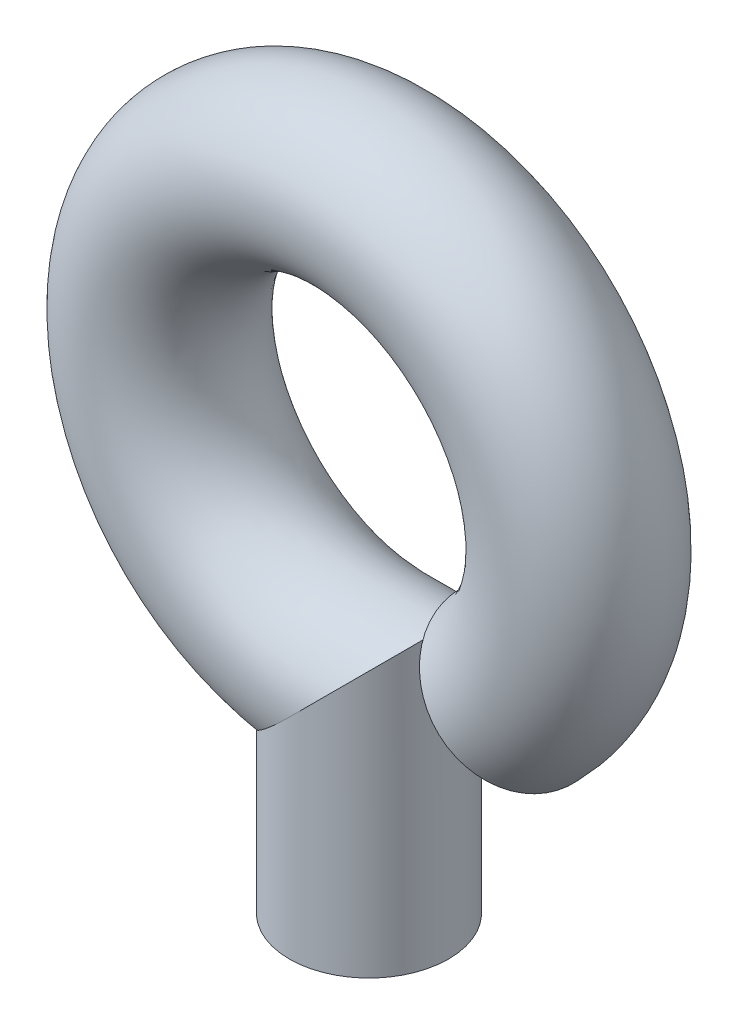
ISO-10303-21;
HEADER;
FILE_DESCRIPTION(('STEP AP214'),'2;1');
FILE_NAME('part.step','',(''),(''),'','','');
FILE_SCHEMA(('AUTOMOTIVE_DESIGN { 1 0 10303 214 1 1 1 1 }'));
ENDSEC;
DATA;
#1=APPLICATION_CONTEXT('core data for automotive mechanical design processes');
#2=APPLICATION_PROTOCOL_DEFINITION('international standard','automotive_design',2000,#1);
#3=PRODUCT_CONTEXT('',#1,'mechanical');
#4=PRODUCT('Part','Part','',(#3));
#5=PRODUCT_RELATED_PRODUCT_CATEGORY('part','',(#4));
#6=PRODUCT_DEFINITION_FORMATION('','',#4);
#7=PRODUCT_DEFINITION_CONTEXT('part definition',#1,'design');
#8=PRODUCT_DEFINITION('design','',#6,#7);
#9=PRODUCT_DEFINITION_SHAPE('','',#8);
#10=(LENGTH_UNIT() NAMED_UNIT(*) SI_UNIT(.MILLI.,.METRE.));
#11=(NAMED_UNIT(*) PLANE_ANGLE_UNIT() SI_UNIT($,.RADIAN.));
#12=(NAMED_UNIT(*) SI_UNIT($,.STERADIAN.) SOLID_ANGLE_UNIT());
#13=UNCERTAINTY_MEASURE_WITH_UNIT(LENGTH_MEASURE(1.E-05),#10,'distance_accuracy_value','');
#14=(GEOMETRIC_REPRESENTATION_CONTEXT(3) GLOBAL_UNCERTAINTY_ASSIGNED_CONTEXT((#13)) GLOBAL_UNIT_ASSIGNED_CONTEXT((#10,
#11,#12)) REPRESENTATION_CONTEXT('',''));
#15=CARTESIAN_POINT('',(0.,0.,0.));
#16=DIRECTION('',(0.,0.,1.));
#17=DIRECTION('',(1.,0.,0.));
#18=AXIS2_PLACEMENT_3D('',#15,#16,#17);
#19=CARTESIAN_POINT('',(8.96291702604749,16.4024381978122,0.));
#20=DIRECTION('',(0.70846943324313,0.705741498113976,0.));
#21=DIRECTION('',(-0.705741498113976,0.70846943324313,0.));
#22=AXIS2_PLACEMENT_3D('',#19,#20,#21);
#23=PLANE('',#22);
#24=CARTESIAN_POINT('',(8.96291702604749,16.4024381978122,0.));
#25=DIRECTION('',(0.70846943324313,0.705741498113976,0.));
#26=DIRECTION('',(-0.705741498113976,0.70846943324313,0.));
#27=AXIS2_PLACEMENT_3D('',#24,#25,#26);
#28=CIRCLE('',#27,4.826);
#29=CARTESIAN_POINT('',(5.55700855614944,19.8215116826436,0.));
#30=VERTEX_POINT('',#29);
#31=EDGE_CURVE('E54',#30,#30,#28,.T.);
#32=ORIENTED_EDGE('',*,*,#31,.F.);
#33=EDGE_LOOP('',(#32));
#34=FACE_BOUND('',#33,.T.);
#35=ADVANCED_FACE('F51',(#34),#23,.F.);
#36=CARTESIAN_POINT('',(0.,0.,0.));
#37=DIRECTION('',(0.,-1.,0.));
#38=DIRECTION('',(1.,0.,0.));
#39=AXIS2_PLACEMENT_3D('',#36,#37,#38);
#40=PLANE('',#39);
#41=CARTESIAN_POINT('',(0.,0.,0.));
#42=DIRECTION('',(0.,-1.,0.));
#43=DIRECTION('',(1.,0.,0.));
#44=AXIS2_PLACEMENT_3D('',#41,#42,#43);
#45=CIRCLE('',#44,4.826);
#46=CARTESIAN_POINT('',(4.826,0.,0.));
#47=VERTEX_POINT('',#46);
#48=EDGE_CURVE('E71',#47,#47,#45,.T.);
#49=ORIENTED_EDGE('',*,*,#48,.T.);
#50=EDGE_LOOP('',(#49));
#51=FACE_BOUND('',#50,.T.);
#52=ADVANCED_FACE('F75',(#51),#40,.T.);
#53=CARTESIAN_POINT('',(5.4086,17.526,0.));
#54=CARTESIAN_POINT('',(4.50716666666808,17.526,0.));
#55=CARTESIAN_POINT('',(3.6057333333327,17.526,0.));
#56=CARTESIAN_POINT('',(2.25358333333365,17.526,0.));
#57=CARTESIAN_POINT('',(1.80286666666713,17.526,0.));
#58=CARTESIAN_POINT('',(1.12679166666643,17.526,0.));
#59=CARTESIAN_POINT('',(0.901433333333169,17.526,0.));
#60=CARTESIAN_POINT('',(0.563395833333408,17.526,0.));
#61=CARTESIAN_POINT('',(0.450716666666778,17.526,0.));
#62=CARTESIAN_POINT('',(0.225358333333213,17.526,0.));
#63=CARTESIAN_POINT('',(0.0912700971983508,17.5259986247839,0.));
#64=CARTESIAN_POINT('',(-0.0737885705267274,17.5260011118124,0.));
#65=CARTESIAN_POINT('',(-0.112948067890733,17.5266077038465,0.));
#66=CARTESIAN_POINT('',(-0.225838103046428,17.5290368653846,0.));
#67=CARTESIAN_POINT('',(-0.282260227223491,17.5308583253357,0.));
#68=CARTESIAN_POINT('',(-0.451425103478683,17.538140582317,0.));
#69=CARTESIAN_POINT('',(-0.564066616799512,17.5454194189327,0.));
#70=CARTESIAN_POINT('',(-0.901313613403931,17.5745009883571,0.));
#71=CARTESIAN_POINT('',(-1.1252445002673,17.6035526562468,0.));
#72=CARTESIAN_POINT('',(-1.79202754588701,17.7193701591522,0.));
#73=CARTESIAN_POINT('',(-2.22986929565793,17.8348792992875,0.));
#74=CARTESIAN_POINT('',(-3.50394790292318,18.2911186349695,0.));
#75=CARTESIAN_POINT('',(-4.29942197102122,18.7420138670557,0.));
#76=CARTESIAN_POINT('',(-5.69393839375073,19.8870267369146,0.));
#77=CARTESIAN_POINT('',(-6.29147007152276,20.5800450731297,0.));
#78=CARTESIAN_POINT('',(-7.21896736269934,22.1287507929993,0.));
#79=CARTESIAN_POINT('',(-7.54786288814307,22.9826513340009,0.));
#80=CARTESIAN_POINT('',(-7.89902347578029,24.7525149576165,0.));
#81=CARTESIAN_POINT('',(-7.92105494716986,25.6673007329981,0.));
#82=CARTESIAN_POINT('',(-7.6551010173477,27.4528004219139,0.));
#83=CARTESIAN_POINT('',(-7.36742247174094,28.321454239595,0.));
#84=CARTESIAN_POINT('',(-6.51570011121342,29.9121459209371,0.));
#85=CARTESIAN_POINT('',(-5.95222285910246,30.6331256619263,0.));
#86=CARTESIAN_POINT('',(-4.61363660664622,31.8442934771664,0.));
#87=CARTESIAN_POINT('',(-3.84007205686405,32.3330841152564,0.));
#88=CARTESIAN_POINT('',(-2.17239149631208,33.0219763800396,0.));
#89=CARTESIAN_POINT('',(-1.27938482096156,33.221619757942,0.));
#90=CARTESIAN_POINT('',(0.523734011059012,33.3082402494927,0.));
#91=CARTESIAN_POINT('',(1.43176574301625,33.1951174210693,0.));
#92=CARTESIAN_POINT('',(3.15780213130015,32.6692568018131,0.));
#93=CARTESIAN_POINT('',(3.97465863408128,32.2568688116745,0.));
#94=CARTESIAN_POINT('',(5.42318008936349,31.1795915838683,0.));
#95=CARTESIAN_POINT('',(6.05317374887859,30.5159453004384,0.));
#96=CARTESIAN_POINT('',(7.05345341156542,29.0142224228709,0.));
#97=CARTESIAN_POINT('',(7.42307403210196,28.1771447697136,0.));
#98=CARTESIAN_POINT('',(7.85895644677222,26.4253607783114,0.));
#99=CARTESIAN_POINT('',(7.92471531649008,25.5126755689982,0.));
#100=CARTESIAN_POINT('',(7.65488157421396,22.8196134765485,0.));
#101=CARTESIAN_POINT('',(6.83747144611513,21.0970441983539,0.));
#102=CARTESIAN_POINT('',(5.55700855614944,19.8215116826436,0.));
#103=CARTESIAN_POINT('',(5.4086,17.526,9.652));
#104=CARTESIAN_POINT('',(4.50716666666808,17.526,9.652));
#105=CARTESIAN_POINT('',(3.6057333333327,17.526,9.652));
#106=CARTESIAN_POINT('',(2.25358333333365,17.526,9.652));
#107=CARTESIAN_POINT('',(1.80286666666713,17.526,9.652));
#108=CARTESIAN_POINT('',(1.12679166666643,17.526,9.652));
#109=CARTESIAN_POINT('',(0.901433333333169,17.526,9.652));
#110=CARTESIAN_POINT('',(0.563395833333408,17.526,9.652));
#111=CARTESIAN_POINT('',(0.450716666666778,17.526,9.652));
#112=CARTESIAN_POINT('',(0.225358333333213,17.526,9.652));
#113=CARTESIAN_POINT('',(0.0912700971983508,17.5259986247839,9.652));
#114=CARTESIAN_POINT('',(-0.0737885705267274,17.5260011118124,9.652));
#115=CARTESIAN_POINT('',(-0.112948067890733,17.5266077038465,9.652));
#116=CARTESIAN_POINT('',(-0.225838103046428,17.5290368653846,9.652));
#117=CARTESIAN_POINT('',(-0.282260227223491,17.5308583253357,9.652));
#118=CARTESIAN_POINT('',(-0.451425103478683,17.538140582317,9.652));
#119=CARTESIAN_POINT('',(-0.564066616799512,17.5454194189327,9.652));
#120=CARTESIAN_POINT('',(-0.901313613403931,17.5745009883571,9.652));
#121=CARTESIAN_POINT('',(-1.1252445002673,17.6035526562468,9.652));
#122=CARTESIAN_POINT('',(-1.79202754588701,17.7193701591522,9.652));
#123=CARTESIAN_POINT('',(-2.22986929565793,17.8348792992875,9.652));
#124=CARTESIAN_POINT('',(-3.50394790292318,18.2911186349695,9.652));
#125=CARTESIAN_POINT('',(-4.29942197102122,18.7420138670557,9.652));
#126=CARTESIAN_POINT('',(-5.69393839375073,19.8870267369146,9.652));
#127=CARTESIAN_POINT('',(-6.29147007152276,20.5800450731297,9.652));
#128=CARTESIAN_POINT('',(-7.21896736269934,22.1287507929993,9.652));
#129=CARTESIAN_POINT('',(-7.54786288814307,22.9826513340009,9.652));
#130=CARTESIAN_POINT('',(-7.89902347578029,24.7525149576165,9.652));
#131=CARTESIAN_POINT('',(-7.92105494716986,25.6673007329981,9.652));
#132=CARTESIAN_POINT('',(-7.6551010173477,27.4528004219139,9.652));
#133=CARTESIAN_POINT('',(-7.36742247174094,28.321454239595,9.652));
#134=CARTESIAN_POINT('',(-6.51570011121342,29.9121459209371,9.652));
#135=CARTESIAN_POINT('',(-5.95222285910246,30.6331256619263,9.652));
#136=CARTESIAN_POINT('',(-4.61363660664622,31.8442934771664,9.652));
#137=CARTESIAN_POINT('',(-3.84007205686405,32.3330841152564,9.652));
#138=CARTESIAN_POINT('',(-2.17239149631208,33.0219763800396,9.652));
#139=CARTESIAN_POINT('',(-1.27938482096156,33.221619757942,9.652));
#140=CARTESIAN_POINT('',(0.523734011059012,33.3082402494927,9.652));
#141=CARTESIAN_POINT('',(1.43176574301625,33.1951174210693,9.652));
#142=CARTESIAN_POINT('',(3.15780213130015,32.6692568018131,9.652));
#143=CARTESIAN_POINT('',(3.97465863408128,32.2568688116745,9.652));
#144=CARTESIAN_POINT('',(5.42318008936349,31.1795915838683,9.652));
#145=CARTESIAN_POINT('',(6.05317374887859,30.5159453004384,9.652));
#146=CARTESIAN_POINT('',(7.05345341156542,29.0142224228709,9.652));
#147=CARTESIAN_POINT('',(7.42307403210196,28.1771447697136,9.652));
#148=CARTESIAN_POINT('',(7.85895644677222,26.4253607783114,9.652));
#149=CARTESIAN_POINT('',(7.92471531649008,25.5126755689982,9.652));
#150=CARTESIAN_POINT('',(7.65488157421396,22.8196134765485,9.652));
#151=CARTESIAN_POINT('',(6.83747144611513,21.0970441983539,9.652));
#152=CARTESIAN_POINT('',(5.55700855614944,19.8215116826436,9.652));
#153=CARTESIAN_POINT('',(5.40860000000001,7.874,9.652));
#154=CARTESIAN_POINT('',(4.5071666666681,7.874,9.652));
#155=CARTESIAN_POINT('',(3.60573333333271,7.874,9.652));
#156=CARTESIAN_POINT('',(2.25358333333366,7.874,9.652));
#157=CARTESIAN_POINT('',(1.80286666666714,7.874,9.652));
#158=CARTESIAN_POINT('',(1.12679166666644,7.874,9.652));
#159=CARTESIAN_POINT('',(0.901433333333179,7.874,9.652));
#160=CARTESIAN_POINT('',(0.563395833333418,7.874,9.652));
#161=CARTESIAN_POINT('',(0.450716666666789,7.874,9.652));
#162=CARTESIAN_POINT('',(0.225358333333223,7.874,9.652));
#163=CARTESIAN_POINT('',(0.134088146452126,7.87399693903532,9.652));
#164=CARTESIAN_POINT('',(-0.108405413766313,7.87400247467917,9.652));
#165=CARTESIAN_POINT('',(-0.251400538208715,7.87535263114206,9.652));
#166=CARTESIAN_POINT('',(-0.502671906780436,7.8807594745659,9.652));
#167=CARTESIAN_POINT('',(-0.62825663478818,7.88481369187582,9.652));
#168=CARTESIAN_POINT('',(-1.00478490774202,7.90102258644828,9.652));
#169=CARTESIAN_POINT('',(-1.25550311481118,7.91722386794645,9.652));
#170=CARTESIAN_POINT('',(-2.00614965564224,7.98195381279585,9.652));
#171=CARTESIAN_POINT('',(-2.50457646833795,8.04661720261307,9.652));
#172=CARTESIAN_POINT('',(-3.98870647310123,8.30440454779178,9.652));
#173=CARTESIAN_POINT('',(-4.96325746452233,8.56150553712354,9.652));
#174=CARTESIAN_POINT('',(-7.79910984845509,9.57700599396508,9.652));
#175=CARTESIAN_POINT('',(-9.56968116131326,10.5806115105413,9.652));
#176=CARTESIAN_POINT('',(-12.6736048118888,13.129188543457,9.652));
#177=CARTESIAN_POINT('',(-14.0035946753295,14.6717132272886,9.652));
#178=CARTESIAN_POINT('',(-16.0680241298745,18.1188324102244,9.652));
#179=CARTESIAN_POINT('',(-16.8000819123097,20.0194497434221,9.652));
#180=CARTESIAN_POINT('',(-17.5816974138423,23.958823615339,9.652));
#181=CARTESIAN_POINT('',(-17.6307352049946,25.9949596960239,9.652));
#182=CARTESIAN_POINT('',(-17.0387732321574,29.9691364229738,9.652));
#183=CARTESIAN_POINT('',(-16.3984564693557,31.9025916945763,9.652));
#184=CARTESIAN_POINT('',(-14.502687344317,35.4431635014467,9.652));
#185=CARTESIAN_POINT('',(-13.2484960412291,37.0479248604231,9.652));
#186=CARTESIAN_POINT('',(-10.2690621244696,39.7437499975575,9.652));
#187=CARTESIAN_POINT('',(-8.54725715882737,40.8317033533085,9.652));
#188=CARTESIAN_POINT('',(-4.8353230079195,42.3650442007376,9.652));
#189=CARTESIAN_POINT('',(-2.84766298858795,42.8094117192991,9.652));
#190=CARTESIAN_POINT('',(1.16573054074034,43.0022121682168,9.652));
#191=CARTESIAN_POINT('',(3.18683342799616,42.7504226468972,9.652));
#192=CARTESIAN_POINT('',(7.02865635677258,41.5799586879055,9.652));
#193=CARTESIAN_POINT('',(8.84682083069643,40.6620628388859,9.652));
#194=CARTESIAN_POINT('',(12.0709492311645,38.2642522350643,9.652));
#195=CARTESIAN_POINT('',(13.4731931829853,36.7871040558085,9.652));
#196=CARTESIAN_POINT('',(15.6996221096159,33.444559586396,9.652));
#197=CARTESIAN_POINT('',(16.5223260714514,31.5813867454929,9.652));
#198=CARTESIAN_POINT('',(17.4925159621718,27.682254635595,9.652));
#199=CARTESIAN_POINT('',(17.6388824786401,25.6507940084115,9.652));
#200=CARTESIAN_POINT('',(17.0382847942163,19.6565590284545,9.652));
#201=CARTESIAN_POINT('',(15.2188880574924,15.8224532156537,9.652));
#202=CARTESIAN_POINT('',(12.3688254959455,12.9833647129809,9.652));
#203=CARTESIAN_POINT('',(5.40860000000001,7.874,0.));
#204=CARTESIAN_POINT('',(4.5071666666681,7.874,0.));
#205=CARTESIAN_POINT('',(3.60573333333271,7.874,0.));
#206=CARTESIAN_POINT('',(2.25358333333366,7.874,0.));
#207=CARTESIAN_POINT('',(1.80286666666714,7.874,0.));
#208=CARTESIAN_POINT('',(1.12679166666644,7.874,0.));
#209=CARTESIAN_POINT('',(0.901433333333179,7.874,0.));
#210=CARTESIAN_POINT('',(0.563395833333418,7.874,0.));
#211=CARTESIAN_POINT('',(0.450716666666789,7.874,0.));
#212=CARTESIAN_POINT('',(0.225358333333223,7.874,0.));
#213=CARTESIAN_POINT('',(0.134088146452126,7.87399693903532,0.));
#214=CARTESIAN_POINT('',(-0.108405413766313,7.87400247467917,0.));
#215=CARTESIAN_POINT('',(-0.251400538208715,7.87535263114206,0.));
#216=CARTESIAN_POINT('',(-0.502671906780436,7.8807594745659,0.));
#217=CARTESIAN_POINT('',(-0.62825663478818,7.88481369187582,0.));
#218=CARTESIAN_POINT('',(-1.00478490774202,7.90102258644828,0.));
#219=CARTESIAN_POINT('',(-1.25550311481118,7.91722386794645,0.));
#220=CARTESIAN_POINT('',(-2.00614965564224,7.98195381279585,0.));
#221=CARTESIAN_POINT('',(-2.50457646833795,8.04661720261307,0.));
#222=CARTESIAN_POINT('',(-3.98870647310123,8.30440454779178,0.));
#223=CARTESIAN_POINT('',(-4.96325746452233,8.56150553712354,0.));
#224=CARTESIAN_POINT('',(-7.79910984845509,9.57700599396508,0.));
#225=CARTESIAN_POINT('',(-9.56968116131326,10.5806115105413,0.));
#226=CARTESIAN_POINT('',(-12.6736048118888,13.129188543457,0.));
#227=CARTESIAN_POINT('',(-14.0035946753295,14.6717132272886,0.));
#228=CARTESIAN_POINT('',(-16.0680241298745,18.1188324102244,0.));
#229=CARTESIAN_POINT('',(-16.8000819123097,20.0194497434221,0.));
#230=CARTESIAN_POINT('',(-17.5816974138423,23.958823615339,0.));
#231=CARTESIAN_POINT('',(-17.6307352049946,25.9949596960239,0.));
#232=CARTESIAN_POINT('',(-17.0387732321574,29.9691364229738,0.));
#233=CARTESIAN_POINT('',(-16.3984564693557,31.9025916945763,0.));
#234=CARTESIAN_POINT('',(-14.502687344317,35.4431635014467,0.));
#235=CARTESIAN_POINT('',(-13.2484960412291,37.0479248604231,0.));
#236=CARTESIAN_POINT('',(-10.2690621244696,39.7437499975575,0.));
#237=CARTESIAN_POINT('',(-8.54725715882737,40.8317033533085,0.));
#238=CARTESIAN_POINT('',(-4.8353230079195,42.3650442007376,0.));
#239=CARTESIAN_POINT('',(-2.84766298858795,42.8094117192991,0.));
#240=CARTESIAN_POINT('',(1.16573054074034,43.0022121682168,0.));
#241=CARTESIAN_POINT('',(3.18683342799616,42.7504226468972,0.));
#242=CARTESIAN_POINT('',(7.02865635677258,41.5799586879055,0.));
#243=CARTESIAN_POINT('',(8.84682083069643,40.6620628388859,0.));
#244=CARTESIAN_POINT('',(12.0709492311645,38.2642522350643,0.));
#245=CARTESIAN_POINT('',(13.4731931829853,36.7871040558085,0.));
#246=CARTESIAN_POINT('',(15.6996221096159,33.444559586396,0.));
#247=CARTESIAN_POINT('',(16.5223260714514,31.5813867454929,0.));
#248=CARTESIAN_POINT('',(17.4925159621718,27.682254635595,0.));
#249=CARTESIAN_POINT('',(17.6388824786401,25.6507940084115,0.));
#250=CARTESIAN_POINT('',(17.0382847942163,19.6565590284545,0.));
#251=CARTESIAN_POINT('',(15.2188880574924,15.8224532156537,0.));
#252=CARTESIAN_POINT('',(12.3688254959455,12.9833647129809,0.));
#253=CARTESIAN_POINT('',(5.40860000000001,7.874,-9.652));
#254=CARTESIAN_POINT('',(4.5071666666681,7.874,-9.652));
#255=CARTESIAN_POINT('',(3.60573333333271,7.874,-9.652));
#256=CARTESIAN_POINT('',(2.25358333333366,7.874,-9.652));
#257=CARTESIAN_POINT('',(1.80286666666714,7.874,-9.652));
#258=CARTESIAN_POINT('',(1.12679166666644,7.874,-9.652));
#259=CARTESIAN_POINT('',(0.901433333333179,7.874,-9.652));
#260=CARTESIAN_POINT('',(0.563395833333418,7.874,-9.652));
#261=CARTESIAN_POINT('',(0.450716666666789,7.874,-9.652));
#262=CARTESIAN_POINT('',(0.225358333333223,7.874,-9.652));
#263=CARTESIAN_POINT('',(0.134088146452126,7.87399693903532,-9.652));
#264=CARTESIAN_POINT('',(-0.108405413766313,7.87400247467917,-9.652));
#265=CARTESIAN_POINT('',(-0.251400538208715,7.87535263114206,-9.652));
#266=CARTESIAN_POINT('',(-0.502671906780436,7.8807594745659,-9.652));
#267=CARTESIAN_POINT('',(-0.62825663478818,7.88481369187582,-9.652));
#268=CARTESIAN_POINT('',(-1.00478490774202,7.90102258644828,-9.652));
#269=CARTESIAN_POINT('',(-1.25550311481118,7.91722386794645,-9.652));
#270=CARTESIAN_POINT('',(-2.00614965564224,7.98195381279585,-9.652));
#271=CARTESIAN_POINT('',(-2.50457646833795,8.04661720261307,-9.652));
#272=CARTESIAN_POINT('',(-3.98870647310123,8.30440454779178,-9.652));
#273=CARTESIAN_POINT('',(-4.96325746452233,8.56150553712354,-9.652));
#274=CARTESIAN_POINT('',(-7.79910984845509,9.57700599396508,-9.652));
#275=CARTESIAN_POINT('',(-9.56968116131326,10.5806115105413,-9.652));
#276=CARTESIAN_POINT('',(-12.6736048118888,13.129188543457,-9.652));
#277=CARTESIAN_POINT('',(-14.0035946753295,14.6717132272886,-9.652));
#278=CARTESIAN_POINT('',(-16.0680241298745,18.1188324102244,-9.652));
#279=CARTESIAN_POINT('',(-16.8000819123097,20.0194497434221,-9.652));
#280=CARTESIAN_POINT('',(-17.5816974138423,23.958823615339,-9.652));
#281=CARTESIAN_POINT('',(-17.6307352049946,25.9949596960239,-9.652));
#282=CARTESIAN_POINT('',(-17.0387732321574,29.9691364229738,-9.652));
#283=CARTESIAN_POINT('',(-16.3984564693557,31.9025916945763,-9.652));
#284=CARTESIAN_POINT('',(-14.502687344317,35.4431635014467,-9.652));
#285=CARTESIAN_POINT('',(-13.2484960412291,37.0479248604231,-9.652));
#286=CARTESIAN_POINT('',(-10.2690621244696,39.7437499975575,-9.652));
#287=CARTESIAN_POINT('',(-8.54725715882737,40.8317033533085,-9.652));
#288=CARTESIAN_POINT('',(-4.8353230079195,42.3650442007376,-9.652));
#289=CARTESIAN_POINT('',(-2.84766298858795,42.8094117192991,-9.652));
#290=CARTESIAN_POINT('',(1.16573054074034,43.0022121682168,-9.652));
#291=CARTESIAN_POINT('',(3.18683342799616,42.7504226468972,-9.652));
#292=CARTESIAN_POINT('',(7.02865635677258,41.5799586879055,-9.652));
#293=CARTESIAN_POINT('',(8.84682083069643,40.6620628388859,-9.652));
#294=CARTESIAN_POINT('',(12.0709492311645,38.2642522350643,-9.652));
#295=CARTESIAN_POINT('',(13.4731931829853,36.7871040558085,-9.652));
#296=CARTESIAN_POINT('',(15.6996221096159,33.444559586396,-9.652));
#297=CARTESIAN_POINT('',(16.5223260714514,31.5813867454929,-9.652));
#298=CARTESIAN_POINT('',(17.4925159621718,27.682254635595,-9.652));
#299=CARTESIAN_POINT('',(17.6388824786401,25.6507940084115,-9.652));
#300=CARTESIAN_POINT('',(17.0382847942163,19.6565590284545,-9.652));
#301=CARTESIAN_POINT('',(15.2188880574924,15.8224532156537,-9.652));
#302=CARTESIAN_POINT('',(12.3688254959455,12.9833647129809,-9.652));
#303=CARTESIAN_POINT('',(5.4086,17.526,-9.652));
#304=CARTESIAN_POINT('',(4.50716666666808,17.526,-9.652));
#305=CARTESIAN_POINT('',(3.6057333333327,17.526,-9.652));
#306=CARTESIAN_POINT('',(2.25358333333365,17.526,-9.652));
#307=CARTESIAN_POINT('',(1.80286666666713,17.526,-9.652));
#308=CARTESIAN_POINT('',(1.12679166666643,17.526,-9.652));
#309=CARTESIAN_POINT('',(0.901433333333169,17.526,-9.652));
#310=CARTESIAN_POINT('',(0.563395833333408,17.526,-9.652));
#311=CARTESIAN_POINT('',(0.450716666666778,17.526,-9.652));
#312=CARTESIAN_POINT('',(0.225358333333213,17.526,-9.652));
#313=CARTESIAN_POINT('',(0.0912700971983508,17.5259986247839,-9.652));
#314=CARTESIAN_POINT('',(-0.0737885705267274,17.5260011118124,-9.652));
#315=CARTESIAN_POINT('',(-0.112948067890733,17.5266077038465,-9.652));
#316=CARTESIAN_POINT('',(-0.225838103046428,17.5290368653846,-9.652));
#317=CARTESIAN_POINT('',(-0.282260227223491,17.5308583253357,-9.652));
#318=CARTESIAN_POINT('',(-0.451425103478683,17.538140582317,-9.652));
#319=CARTESIAN_POINT('',(-0.564066616799512,17.5454194189327,-9.652));
#320=CARTESIAN_POINT('',(-0.901313613403931,17.5745009883571,-9.652));
#321=CARTESIAN_POINT('',(-1.1252445002673,17.6035526562468,-9.652));
#322=CARTESIAN_POINT('',(-1.79202754588701,17.7193701591522,-9.652));
#323=CARTESIAN_POINT('',(-2.22986929565793,17.8348792992875,-9.652));
#324=CARTESIAN_POINT('',(-3.50394790292318,18.2911186349695,-9.652));
#325=CARTESIAN_POINT('',(-4.29942197102122,18.7420138670557,-9.652));
#326=CARTESIAN_POINT('',(-5.69393839375073,19.8870267369146,-9.652));
#327=CARTESIAN_POINT('',(-6.29147007152276,20.5800450731297,-9.652));
#328=CARTESIAN_POINT('',(-7.21896736269934,22.1287507929993,-9.652));
#329=CARTESIAN_POINT('',(-7.54786288814307,22.9826513340009,-9.652));
#330=CARTESIAN_POINT('',(-7.89902347578029,24.7525149576165,-9.652));
#331=CARTESIAN_POINT('',(-7.92105494716986,25.6673007329981,-9.652));
#332=CARTESIAN_POINT('',(-7.6551010173477,27.4528004219139,-9.652));
#333=CARTESIAN_POINT('',(-7.36742247174094,28.321454239595,-9.652));
#334=CARTESIAN_POINT('',(-6.51570011121342,29.9121459209371,-9.652));
#335=CARTESIAN_POINT('',(-5.95222285910246,30.6331256619263,-9.652));
#336=CARTESIAN_POINT('',(-4.61363660664622,31.8442934771664,-9.652));
#337=CARTESIAN_POINT('',(-3.84007205686405,32.3330841152564,-9.652));
#338=CARTESIAN_POINT('',(-2.17239149631208,33.0219763800396,-9.652));
#339=CARTESIAN_POINT('',(-1.27938482096156,33.221619757942,-9.652));
#340=CARTESIAN_POINT('',(0.523734011059012,33.3082402494927,-9.652));
#341=CARTESIAN_POINT('',(1.43176574301625,33.1951174210693,-9.652));
#342=CARTESIAN_POINT('',(3.15780213130015,32.6692568018131,-9.652));
#343=CARTESIAN_POINT('',(3.97465863408128,32.2568688116745,-9.652));
#344=CARTESIAN_POINT('',(5.42318008936349,31.1795915838683,-9.652));
#345=CARTESIAN_POINT('',(6.05317374887859,30.5159453004384,-9.652));
#346=CARTESIAN_POINT('',(7.05345341156542,29.0142224228709,-9.652));
#347=CARTESIAN_POINT('',(7.42307403210196,28.1771447697136,-9.652));
#348=CARTESIAN_POINT('',(7.85895644677222,26.4253607783114,-9.652));
#349=CARTESIAN_POINT('',(7.92471531649008,25.5126755689982,-9.652));
#350=CARTESIAN_POINT('',(7.65488157421396,22.8196134765485,-9.652));
#351=CARTESIAN_POINT('',(6.83747144611513,21.0970441983539,-9.652));
#352=CARTESIAN_POINT('',(5.55700855614944,19.8215116826436,-9.652));
#353=CARTESIAN_POINT('',(5.4086,17.526,0.));
#354=CARTESIAN_POINT('',(4.50716666666808,17.526,0.));
#355=CARTESIAN_POINT('',(3.6057333333327,17.526,0.));
#356=CARTESIAN_POINT('',(2.25358333333365,17.526,0.));
#357=CARTESIAN_POINT('',(1.80286666666713,17.526,0.));
#358=CARTESIAN_POINT('',(1.12679166666643,17.526,0.));
#359=CARTESIAN_POINT('',(0.901433333333169,17.526,0.));
#360=CARTESIAN_POINT('',(0.563395833333408,17.526,0.));
#361=CARTESIAN_POINT('',(0.450716666666778,17.526,0.));
#362=CARTESIAN_POINT('',(0.225358333333213,17.526,0.));
#363=CARTESIAN_POINT('',(0.0912700971983508,17.5259986247839,0.));
#364=CARTESIAN_POINT('',(-0.0737885705267274,17.5260011118124,0.));
#365=CARTESIAN_POINT('',(-0.112948067890733,17.5266077038465,0.));
#366=CARTESIAN_POINT('',(-0.225838103046428,17.5290368653846,0.));
#367=CARTESIAN_POINT('',(-0.282260227223491,17.5308583253357,0.));
#368=CARTESIAN_POINT('',(-0.451425103478683,17.538140582317,0.));
#369=CARTESIAN_POINT('',(-0.564066616799512,17.5454194189327,0.));
#370=CARTESIAN_POINT('',(-0.901313613403931,17.5745009883571,0.));
#371=CARTESIAN_POINT('',(-1.1252445002673,17.6035526562468,0.));
#372=CARTESIAN_POINT('',(-1.79202754588701,17.7193701591522,0.));
#373=CARTESIAN_POINT('',(-2.22986929565793,17.8348792992875,0.));
#374=CARTESIAN_POINT('',(-3.50394790292318,18.2911186349695,0.));
#375=CARTESIAN_POINT('',(-4.29942197102122,18.7420138670557,0.));
#376=CARTESIAN_POINT('',(-5.69393839375073,19.8870267369146,0.));
#377=CARTESIAN_POINT('',(-6.29147007152276,20.5800450731297,0.));
#378=CARTESIAN_POINT('',(-7.21896736269934,22.1287507929993,0.));
#379=CARTESIAN_POINT('',(-7.54786288814307,22.9826513340009,0.));
#380=CARTESIAN_POINT('',(-7.89902347578029,24.7525149576165,0.));
#381=CARTESIAN_POINT('',(-7.92105494716986,25.6673007329981,0.));
#382=CARTESIAN_POINT('',(-7.6551010173477,27.4528004219139,0.));
#383=CARTESIAN_POINT('',(-7.36742247174094,28.321454239595,0.));
#384=CARTESIAN_POINT('',(-6.51570011121342,29.9121459209371,0.));
#385=CARTESIAN_POINT('',(-5.95222285910246,30.6331256619263,0.));
#386=CARTESIAN_POINT('',(-4.61363660664622,31.8442934771664,0.));
#387=CARTESIAN_POINT('',(-3.84007205686405,32.3330841152564,0.));
#388=CARTESIAN_POINT('',(-2.17239149631208,33.0219763800396,0.));
#389=CARTESIAN_POINT('',(-1.27938482096156,33.221619757942,0.));
#390=CARTESIAN_POINT('',(0.523734011059012,33.3082402494927,0.));
#391=CARTESIAN_POINT('',(1.43176574301625,33.1951174210693,0.));
#392=CARTESIAN_POINT('',(3.15780213130015,32.6692568018131,0.));
#393=CARTESIAN_POINT('',(3.97465863408128,32.2568688116745,0.));
#394=CARTESIAN_POINT('',(5.42318008936349,31.1795915838683,0.));
#395=CARTESIAN_POINT('',(6.05317374887859,30.5159453004384,0.));
#396=CARTESIAN_POINT('',(7.05345341156542,29.0142224228709,0.));
#397=CARTESIAN_POINT('',(7.42307403210196,28.1771447697136,0.));
#398=CARTESIAN_POINT('',(7.85895644677222,26.4253607783114,0.));
#399=CARTESIAN_POINT('',(7.92471531649008,25.5126755689982,0.));
#400=CARTESIAN_POINT('',(7.65488157421396,22.8196134765485,0.));
#401=CARTESIAN_POINT('',(6.83747144611513,21.0970441983539,0.));
#402=CARTESIAN_POINT('',(5.55700855614944,19.8215116826436,0.));
#403=(BOUNDED_SURFACE() B_SPLINE_SURFACE(3,3,((#53,#54,#55,#56,#57,#58,#59,#60,#61,#62,#63,#64,
#65,#66,#67,#68,#69,#70,#71,#72,#73,#74,#75,#76,#77,#78,#79,#80,#81,#82,#83,#84,#85,#86,#87,#88,
#89,#90,#91,#92,#93,#94,#95,#96,#97,#98,#99,#100,#101,#102),(#103,#104,#105,#106,#107,#108,#109,
#110,#111,#112,#113,#114,#115,#116,#117,#118,#119,#120,#121,#122,#123,#124,#125,#126,#127,#128,
#129,#130,#131,#132,#133,#134,#135,#136,#137,#138,#139,#140,#141,#142,#143,#144,#145,#146,#147,
#148,#149,#150,#151,#152),(#153,#154,#155,#156,#157,#158,#159,#160,#161,#162,#163,#164,#165,
#166,#167,#168,#169,#170,#171,#172,#173,#174,#175,#176,#177,#178,#179,#180,#181,#182,#183,#184,
#185,#186,#187,#188,#189,#190,#191,#192,#193,#194,#195,#196,#197,#198,#199,#200,#201,#202),
(#203,#204,#205,#206,#207,#208,#209,#210,#211,#212,#213,#214,#215,#216,#217,#218,#219,#220,#221,
#222,#223,#224,#225,#226,#227,#228,#229,#230,#231,#232,#233,#234,#235,#236,#237,#238,#239,#240,
#241,#242,#243,#244,#245,#246,#247,#248,#249,#250,#251,#252),(#253,#254,#255,#256,#257,#258,
#259,#260,#261,#262,#263,#264,#265,#266,#267,#268,#269,#270,#271,#272,#273,#274,#275,#276,#277,
#278,#279,#280,#281,#282,#283,#284,#285,#286,#287,#288,#289,#290,#291,#292,#293,#294,#295,#296,
#297,#298,#299,#300,#301,#302),(#303,#304,#305,#306,#307,#308,#309,#310,#311,#312,#313,#314,
#315,#316,#317,#318,#319,#320,#321,#322,#323,#324,#325,#326,#327,#328,#329,#330,#331,#332,#333,
#334,#335,#336,#337,#338,#339,#340,#341,#342,#343,#344,#345,#346,#347,#348,#349,#350,#351,#352),
(#353,#354,#355,#356,#357,#358,#359,#360,#361,#362,#363,#364,#365,#366,#367,#368,#369,#370,#371,
#372,#373,#374,#375,#376,#377,#378,#379,#380,#381,#382,#383,#384,#385,#386,#387,#388,#389,#390,
#391,#392,#393,#394,#395,#396,#397,#398,#399,#400,#401,#402)),.UNSPECIFIED.,.T.,.F.,
.F.) B_SPLINE_SURFACE_WITH_KNOTS((4,3,4),(4,2,2,2,2,2,2,2,2,2,2,2,2,2,2,2,2,2,2,2,2,2,2,2,4),
(0.,0.5,1.),(-0.0773071091386869,-0.0386535545693435,-0.0193267772846717,-0.00966338864233586,
-0.00483169432116793,0.,0.00390625,0.0078125,0.015625,0.03125,0.0625,0.125,0.1875,0.25,0.3125,
0.375,0.4375,0.5,0.5625,0.625,0.6875,0.75,0.8125,0.875,1.),
.UNSPECIFIED.) GEOMETRIC_REPRESENTATION_ITEM() RATIONAL_B_SPLINE_SURFACE(((1.,1.,1.,1.,1.,1.,1.,
1.,1.,1.,1.,1.,1.,1.,1.,1.,1.,1.,1.,1.,1.,1.,1.,1.,1.,1.,1.,1.,1.,1.,1.,1.,1.,1.,1.,1.,1.,1.,1.,
1.,1.,1.,1.,1.,1.,1.,1.,1.,1.,1.),(0.333333333333333,0.333333333333333,0.333333333333333,
0.333333333333333,0.333333333333333,0.333333333333333,0.333333333333333,0.333333333333333,
0.333333333333333,0.333333333333333,0.333333333333333,0.333333333333333,0.333333333333333,
0.333333333333333,0.333333333333333,0.333333333333333,0.333333333333333,0.333333333333333,
0.333333333333333,0.333333333333333,0.333333333333333,0.333333333333333,0.333333333333333,
0.333333333333333,0.333333333333333,0.333333333333333,0.333333333333333,0.333333333333333,
0.333333333333333,0.333333333333333,0.333333333333333,0.333333333333333,0.333333333333333,
0.333333333333333,0.333333333333333,0.333333333333333,0.333333333333333,0.333333333333333,
0.333333333333333,0.333333333333333,0.333333333333333,0.333333333333333,0.333333333333333,
0.333333333333333,0.333333333333333,0.333333333333333,0.333333333333333,0.333333333333333,
0.333333333333333,0.333333333333333),(0.333333333333333,0.333333333333333,0.333333333333333,
0.333333333333333,0.333333333333333,0.333333333333333,0.333333333333333,0.333333333333333,
0.333333333333333,0.333333333333333,0.333333333333333,0.333333333333333,0.333333333333333,
0.333333333333333,0.333333333333333,0.333333333333333,0.333333333333333,0.333333333333333,
0.333333333333333,0.333333333333333,0.333333333333333,0.333333333333333,0.333333333333333,
0.333333333333333,0.333333333333333,0.333333333333333,0.333333333333333,0.333333333333333,
0.333333333333333,0.333333333333333,0.333333333333333,0.333333333333333,0.333333333333333,
0.333333333333333,0.333333333333333,0.333333333333333,0.333333333333333,0.333333333333333,
0.333333333333333,0.333333333333333,0.333333333333333,0.333333333333333,0.333333333333333,
0.333333333333333,0.333333333333333,0.333333333333333,0.333333333333333,0.333333333333333,
0.333333333333333,0.333333333333333),(1.,1.,1.,1.,1.,1.,1.,1.,1.,1.,1.,1.,1.,1.,1.,1.,1.,1.,1.,
1.,1.,1.,1.,1.,1.,1.,1.,1.,1.,1.,1.,1.,1.,1.,1.,1.,1.,1.,1.,1.,1.,1.,1.,1.,1.,1.,1.,1.,1.,1.),
(0.333333333333333,0.333333333333333,0.333333333333333,0.333333333333333,0.333333333333333,
0.333333333333333,0.333333333333333,0.333333333333333,0.333333333333333,0.333333333333333,
0.333333333333333,0.333333333333333,0.333333333333333,0.333333333333333,0.333333333333333,
0.333333333333333,0.333333333333333,0.333333333333333,0.333333333333333,0.333333333333333,
0.333333333333333,0.333333333333333,0.333333333333333,0.333333333333333,0.333333333333333,
0.333333333333333,0.333333333333333,0.333333333333333,0.333333333333333,0.333333333333333,
0.333333333333333,0.333333333333333,0.333333333333333,0.333333333333333,0.333333333333333,
0.333333333333333,0.333333333333333,0.333333333333333,0.333333333333333,0.333333333333333,
0.333333333333333,0.333333333333333,0.333333333333333,0.333333333333333,0.333333333333333,
0.333333333333333,0.333333333333333,0.333333333333333,0.333333333333333,0.333333333333333),
(0.333333333333333,0.333333333333333,0.333333333333333,0.333333333333333,0.333333333333333,
0.333333333333333,0.333333333333333,0.333333333333333,0.333333333333333,0.333333333333333,
0.333333333333333,0.333333333333333,0.333333333333333,0.333333333333333,0.333333333333333,
0.333333333333333,0.333333333333333,0.333333333333333,0.333333333333333,0.333333333333333,
0.333333333333333,0.333333333333333,0.333333333333333,0.333333333333333,0.333333333333333,
0.333333333333333,0.333333333333333,0.333333333333333,0.333333333333333,0.333333333333333,
0.333333333333333,0.333333333333333,0.333333333333333,0.333333333333333,0.333333333333333,
0.333333333333333,0.333333333333333,0.333333333333333,0.333333333333333,0.333333333333333,
0.333333333333333,0.333333333333333,0.333333333333333,0.333333333333333,0.333333333333333,
0.333333333333333,0.333333333333333,0.333333333333333,0.333333333333333,0.333333333333333),(1.,
1.,1.,1.,1.,1.,1.,1.,1.,1.,1.,1.,1.,1.,1.,1.,1.,1.,1.,1.,1.,1.,1.,1.,1.,1.,1.,1.,1.,1.,1.,1.,1.,
1.,1.,1.,1.,1.,1.,1.,1.,1.,1.,1.,1.,1.,1.,1.,1.,1.))) REPRESENTATION_ITEM('') SURFACE());
#404=CARTESIAN_POINT('',(0.,12.7,4.82600000000021));
#405=CARTESIAN_POINT('',(-0.00327479430949784,12.6967252607326,4.82599999909709));
#406=CARTESIAN_POINT('',(-0.00655027949675249,12.6934511032389,4.82599666582121));
#407=CARTESIAN_POINT('',(-0.297433127252776,12.4027989715062,4.82540446374136));
#408=CARTESIAN_POINT('',(-0.590320380448359,12.1199336378144,4.79910489836136));
#409=CARTESIAN_POINT('',(-1.17945734060057,11.5679896810023,4.68925592735863));
#410=CARTESIAN_POINT('',(-1.47571180211769,11.2989346000054,4.60561203809731));
#411=CARTESIAN_POINT('',(-2.02058619204373,10.8170444916103,4.39099522405905));
#412=CARTESIAN_POINT('',(-2.27009040402663,10.6016002517514,4.26824343880056));
#413=CARTESIAN_POINT('',(-2.75531247678234,10.1908931265861,3.97229235946137));
#414=CARTESIAN_POINT('',(-2.99105043994579,9.99560047759837,3.79916895144378));
#415=CARTESIAN_POINT('',(-3.39388709349803,9.66737195540945,3.43942089747155));
#416=CARTESIAN_POINT('',(-3.56537593621624,9.52972072366645,3.26211723070945));
#417=CARTESIAN_POINT('',(-3.80494678329599,9.33953215926682,2.9712732810856));
#418=CARTESIAN_POINT('',(-3.88186005892513,9.27885063656549,2.87017711828461));
#419=CARTESIAN_POINT('',(-4.02885715137723,9.16346504374713,2.65989134642449));
#420=CARTESIAN_POINT('',(-4.09894193287803,9.1087601291674,2.55070288443249));
#421=CARTESIAN_POINT('',(-4.22110358954144,9.01382868497209,2.34197986933408));
#422=CARTESIAN_POINT('',(-4.27429559074255,8.97266720073905,2.24352058238555));
#423=CARTESIAN_POINT('',(-4.37437516251699,8.89547746854935,2.0415229650911));
#424=CARTESIAN_POINT('',(-4.42126384027663,8.85944831902546,1.93798553109995));
#425=CARTESIAN_POINT('',(-4.50812158715902,8.79289188224949,1.72632612162426));
#426=CARTESIAN_POINT('',(-4.54809038945047,8.76236480715626,1.61820396955242));
#427=CARTESIAN_POINT('',(-4.62050890852088,8.70717670524358,1.39806705904837));
#428=CARTESIAN_POINT('',(-4.65296221507776,8.6825128776928,1.28605418854338));
#429=CARTESIAN_POINT('',(-4.71000816833884,8.63923128820916,1.05827725761124));
#430=CARTESIAN_POINT('',(-4.7345606588368,8.62064440516202,0.942497228195695));
#431=CARTESIAN_POINT('',(-4.77516922394812,8.58993604282706,0.708605905002461));
#432=CARTESIAN_POINT('',(-4.79122523429475,8.57781461244344,0.590494593598142));
#433=CARTESIAN_POINT('',(-4.81455570318249,8.56021000662719,0.352944107137876));
#434=CARTESIAN_POINT('',(-4.82183230047617,8.55472521444239,0.233505262640356));
#435=CARTESIAN_POINT('',(-4.82747896224908,8.55046850269412,-0.00569798580450923));
#436=CARTESIAN_POINT('',(-4.82584964192075,8.55169611945881,-0.125462366693627));
#437=CARTESIAN_POINT('',(-4.81422486272986,8.56046135314834,-0.354294408428342));
#438=CARTESIAN_POINT('',(-4.8049397148381,8.56746324043633,-0.463419810432942));
#439=CARTESIAN_POINT('',(-4.77905356773926,8.58700581006881,-0.680335740474692));
#440=CARTESIAN_POINT('',(-4.76245009283811,8.5995483667523,-0.788125804087199));
#441=CARTESIAN_POINT('',(-4.72217773647123,8.63001969179177,-1.00154984835923));
#442=CARTESIAN_POINT('',(-4.69851191256343,8.64794612928364,-1.10718474097249));
#443=CARTESIAN_POINT('',(-4.64443413602247,8.68899416640709,-1.31571912350907));
#444=CARTESIAN_POINT('',(-4.61401960810942,8.71211774929328,-1.41861755237725));
#445=CARTESIAN_POINT('',(-4.54641235154291,8.76364843674687,-1.62236783661261));
#446=CARTESIAN_POINT('',(-4.50913690619651,8.79212011599398,-1.72317590138853));
#447=CARTESIAN_POINT('',(-4.42854761589386,8.85386135814011,-1.92084651819278));
#448=CARTESIAN_POINT('',(-4.38523164019222,8.88713261419206,-2.01770766233116));
#449=CARTESIAN_POINT('',(-4.24699025542248,8.9936820855427,-2.3016492642567));
#450=CARTESIAN_POINT('',(-4.14372204717755,9.07373338777797,-2.48223377387902));
#451=CARTESIAN_POINT('',(-3.90632889732281,9.25939430690651,-2.84302193001379));
#452=CARTESIAN_POINT('',(-3.77002202155988,9.36688357867098,-3.02079865679931));
#453=CARTESIAN_POINT('',(-3.48049310685825,9.59787416085063,-3.35031855275779));
#454=CARTESIAN_POINT('',(-3.32725482611017,9.72139086607459,-3.50203636175014));
#455=CARTESIAN_POINT('',(-2.93380153853034,10.0427592450804,-3.84439860211881));
#456=CARTESIAN_POINT('',(-2.68655726200205,10.2482639125628,-4.01982507162842));
#457=CARTESIAN_POINT('',(-2.1785518241806,10.68021944465,-4.31635017811427));
#458=CARTESIAN_POINT('',(-1.91778186977653,10.9066840123568,-4.43741296640671));
#459=CARTESIAN_POINT('',(-1.51898214402688,11.2618641408142,-4.58300584580305));
#460=CARTESIAN_POINT('',(-1.38239737725928,11.385060338074,-4.62593535097135));
#461=CARTESIAN_POINT('',(-1.10916572949259,11.6348856282846,-4.6989355501353));
#462=CARTESIAN_POINT('',(-0.972519063984948,11.7615109841858,-4.72901968708797));
#463=CARTESIAN_POINT('',(-0.697246178493106,12.0202715506639,-4.77745156804816));
#464=CARTESIAN_POINT('',(-0.558633943574326,12.1524661558297,-4.79555661553144));
#465=CARTESIAN_POINT('',(-0.282915794775799,12.4194815634187,-4.81968638920603));
#466=CARTESIAN_POINT('',(-0.14580963569905,12.5543019281385,-4.82571311169367));
#467=CARTESIAN_POINT('',(-0.00655031297954796,12.693451076318,-4.82599666669309));
#468=CARTESIAN_POINT('',(-0.00327482791613487,12.6967252337873,-4.82600000004146));
#469=CARTESIAN_POINT('',(0.,12.7,-4.826));
#470=B_SPLINE_CURVE_WITH_KNOTS('',3,(#404,#405,#406,#407,#408,#409,#410,#411,#412,#413,#414,
#415,#416,#417,#418,#419,#420,#421,#422,#423,#424,#425,#426,#427,#428,#429,#430,#431,#432,#433,
#434,#435,#436,#437,#438,#439,#440,#441,#442,#443,#444,#445,#446,#447,#448,#449,#450,#451,#452,
#453,#454,#455,#456,#457,#458,#459,#460,#461,#462,#463,#464,#465,#466,#467,#468,#469),
.UNSPECIFIED.,.F.,.F.,(4,2,2,2,2,2,2,2,2,2,2,2,2,2,2,2,2,2,2,2,2,2,2,2,2,2,2,2,2,2,2,2,4),(0.,
0.0138938874072679,1.23360297534435,2.45532656771184,3.50677520192298,4.55664793346469,
5.40043577097517,5.82233046767006,6.24416547559887,6.60152508791008,6.95882184733014,
7.31613238109293,7.67327189176435,8.03219891393866,8.39112865097128,8.74997093147454,
9.10878842460837,9.43762894016534,9.76658078363642,10.0953904175197,10.4243257403585,
10.757522949346,11.0908379894999,11.7569976574433,12.4996844365363,13.2430899426002,
14.3358889412105,15.4294075026394,15.9956576170266,16.5613136772262,17.1381050293608,
17.7148010419973,17.7286949294055),.UNSPECIFIED.);
#471=CARTESIAN_POINT('',(0.,12.7,-4.826));
#472=VERTEX_POINT('',#471);
#473=CARTESIAN_POINT('',(0.,12.7,4.82600000000021));
#474=VERTEX_POINT('',#473);
#475=EDGE_CURVE('E60',#472,#474,#470,.F.);
#476=CARTESIAN_POINT('',(0.,12.7,4.82600000000021));
#477=CARTESIAN_POINT('',(0.00327482471667235,12.703274762099,4.82599999789489));
#478=CARTESIAN_POINT('',(0.00654967617918491,12.7065495528289,4.82599666463146));
#479=CARTESIAN_POINT('',(0.195183272761301,12.8951797573936,4.82561276886468));
#480=CARTESIAN_POINT('',(0.380614880133584,13.0806139378416,4.81456257619042));
#481=CARTESIAN_POINT('',(0.750322987503837,13.4503239305638,4.77095168151094));
#482=CARTESIAN_POINT('',(0.934598444855154,13.6345986975812,4.73837377987997));
#483=CARTESIAN_POINT('',(1.30095234084885,14.0009520875833,4.65116384588495));
#484=CARTESIAN_POINT('',(1.48302524899906,14.1830251819463,4.5964848772701));
#485=CARTESIAN_POINT('',(1.84293097725167,14.5429310442564,4.46437154948573));
#486=CARTESIAN_POINT('',(2.02076614133193,14.7207661563164,4.38695010105085));
#487=CARTESIAN_POINT('',(2.31764226795875,15.017642257493,4.23527898351094));
#488=CARTESIAN_POINT('',(2.43824126393729,15.1382412610726,4.16711332333025));
#489=CARTESIAN_POINT('',(2.67568740481017,15.3756874076755,4.01877927172205));
#490=CARTESIAN_POINT('',(2.79253376495932,15.4925337659517,3.93860838937604));
#491=CARTESIAN_POINT('',(3.13561216205683,15.8356121600781,3.67969588770141));
#492=CARTESIAN_POINT('',(3.35512790920134,16.0551279087453,3.48218530929409));
#493=CARTESIAN_POINT('',(3.71217869424436,16.4121786945826,3.09204034497199));
#494=CARTESIAN_POINT('',(3.85624065899647,16.5562406590862,2.91133291314734));
#495=CARTESIAN_POINT('',(4.12255550787993,16.8225555077903,2.52004960556197));
#496=CARTESIAN_POINT('',(4.24483572055969,16.9448357205387,2.3095117609705));
#497=CARTESIAN_POINT('',(4.43831428372907,17.1383142837457,1.90553247332232));
#498=CARTESIAN_POINT('',(4.51484232426932,17.2148423242723,1.71725655206046));
#499=CARTESIAN_POINT('',(4.61242937572183,17.3124293757203,1.42353618188016));
#500=CARTESIAN_POINT('',(4.64209573292132,17.342095732921,1.32372072439774));
#501=CARTESIAN_POINT('',(4.69520468919985,17.3952046892002,1.12084975765744));
#502=CARTESIAN_POINT('',(4.71864999423387,17.4186499942338,1.01779567898232));
#503=CARTESIAN_POINT('',(4.75901872664035,17.4590187266401,0.808375235235157));
#504=CARTESIAN_POINT('',(4.77589497793921,17.4758949779391,0.701990632032594));
#505=CARTESIAN_POINT('',(4.80253625426909,17.5025362542692,0.487445843724379));
#506=CARTESIAN_POINT('',(4.81230126014267,17.5123012601427,0.379285653836161));
#507=CARTESIAN_POINT('',(4.82449927890422,17.5244992789042,0.162174752543371));
#508=CARTESIAN_POINT('',(4.82693469823169,17.5269346982317,0.053224312371501));
#509=CARTESIAN_POINT('',(4.82442383959785,17.5244238395979,-0.164500431312526));
#510=CARTESIAN_POINT('',(4.81947816505689,17.5194781650569,-0.273274748495365));
#511=CARTESIAN_POINT('',(4.80324718249446,17.5032471824945,-0.477988582849252));
#512=CARTESIAN_POINT('',(4.79270279684992,17.4927027968499,-0.574047589487535));
#513=CARTESIAN_POINT('',(4.76601349296911,17.4660134929691,-0.764625967434918));
#514=CARTESIAN_POINT('',(4.74986674252164,17.4498667425217,-0.859144824448963));
#515=CARTESIAN_POINT('',(4.71224297801974,17.4122429780197,-1.04600179424675));
#516=CARTESIAN_POINT('',(4.69076759766706,17.390767597667,-1.13834056593675));
#517=CARTESIAN_POINT('',(4.64281276861282,17.3428127686129,-1.32039519829654));
#518=CARTESIAN_POINT('',(4.61633134083842,17.3163313408387,-1.41011000536496));
#519=CARTESIAN_POINT('',(4.52735744888035,17.2273574488797,-1.6824887835242));
#520=CARTESIAN_POINT('',(4.45701986335487,17.1570198633512,-1.86014050832081));
#521=CARTESIAN_POINT('',(4.2996280393661,16.9996280393698,-2.19968974012173));
#522=CARTESIAN_POINT('',(4.21256523186346,16.9125652318775,-2.36157910705919));
#523=CARTESIAN_POINT('',(3.97365291151036,16.6736529114886,-2.7527654477349));
#524=CARTESIAN_POINT('',(3.81237020025316,16.5123702001512,-2.97065746829871));
#525=CARTESIAN_POINT('',(3.55375382319017,16.2537538232413,-3.26779533750807));
#526=CARTESIAN_POINT('',(3.46460213670875,16.1646021368569,-3.36202468572931));
#527=CARTESIAN_POINT('',(3.28157078809903,15.9815707879508,-3.54089171727806));
#528=CARTESIAN_POINT('',(3.1876909724945,15.8876909719529,-3.62552908895746));
#529=CARTESIAN_POINT('',(2.95487361601597,15.6548736167902,-3.81979787310384));
#530=CARTESIAN_POINT('',(2.81390066026488,15.513900663724,-3.92455269745156));
#531=CARTESIAN_POINT('',(2.52588592237821,15.2258859189177,-4.11583182415789));
#532=CARTESIAN_POINT('',(2.37884162905303,15.0788416159829,-4.20234849077466));
#533=CARTESIAN_POINT('',(2.08021671411385,14.7802167271844,-4.35790283101248));
#534=CARTESIAN_POINT('',(1.92863595721017,14.6286360060323,-4.42693998276492));
#535=CARTESIAN_POINT('',(1.62212950133343,14.3221294524904,-4.54820172414622));
#536=CARTESIAN_POINT('',(1.4672028560745,14.1672026737661,-4.60042148922973));
#537=CARTESIAN_POINT('',(1.09701050331942,13.7970107533936,-4.70492977676261));
#538=CARTESIAN_POINT('',(0.880721724443589,13.5807228187422,-4.75002901766426));
#539=CARTESIAN_POINT('',(0.446189939951533,13.1461888464097,-4.81032712057249));
#540=CARTESIAN_POINT('',(0.227948352871949,12.9279442298829,-4.82554615656945));
#541=CARTESIAN_POINT('',(0.00654967239563115,12.7065495493203,-4.82599666359978));
#542=CARTESIAN_POINT('',(0.00327482094800705,12.7032747586097,-4.82599999683523));
#543=CARTESIAN_POINT('',(0.,12.7,-4.826));
#544=B_SPLINE_CURVE_WITH_KNOTS('',3,(#476,#477,#478,#479,#480,#481,#482,#483,#484,#485,#486,
#487,#488,#489,#490,#491,#492,#493,#494,#495,#496,#497,#498,#499,#500,#501,#502,#503,#504,#505,
#506,#507,#508,#509,#510,#511,#512,#513,#514,#515,#516,#517,#518,#519,#520,#521,#522,#523,#524,
#525,#526,#527,#528,#529,#530,#531,#532,#533,#534,#535,#536,#537,#538,#539,#540,#541,#542,#543),
.UNSPECIFIED.,.F.,.F.,(4,2,2,2,2,2,2,2,2,2,2,2,2,2,2,2,2,2,2,2,2,2,2,2,2,2,2,2,2,2,2,2,2,4),(0.,
0.0138938871465617,0.80029147138262,1.58731811113425,2.37602502328056,3.16428505490444,
3.71483910381582,4.26550754380717,5.36352805692421,6.17783057226792,6.99110411157435,
7.63975926142939,7.96423609134353,8.28857155218602,8.61519507110772,8.94181946993877,
9.26833662020437,9.59482707845051,9.88612023436713,10.1775087454504,10.4688080300349,
10.7602227175861,11.3685300140932,11.9771498074129,12.9177847561384,13.3896932885309,
13.8616171490753,14.5362169899103,15.2110987059607,15.8860005689125,16.5610958745317,
17.4871260118348,18.412530713126,18.4264246002725),.UNSPECIFIED.);
#545=EDGE_CURVE('E12',#472,#474,#544,.F.);
#546=ORIENTED_EDGE('',*,*,#475,.T.);
#547=ORIENTED_EDGE('',*,*,#545,.F.);
#548=EDGE_LOOP('',(#546,#547));
#549=FACE_BOUND('',#548,.T.);
#550=ORIENTED_EDGE('',*,*,#31,.T.);
#551=EDGE_LOOP('',(#550));
#552=FACE_BOUND('',#551,.T.);
#553=ADVANCED_FACE('F72',(#549,#552),#403,.F.);
#554=CARTESIAN_POINT('',(0.,0.,0.));
#555=DIRECTION('',(0.,1.,0.));
#556=DIRECTION('',(0.,0.,1.));
#557=AXIS2_PLACEMENT_3D('',#554,#555,#556);
#558=CYLINDRICAL_SURFACE('',#557,4.826);
#559=ORIENTED_EDGE('',*,*,#545,.T.);
#560=ORIENTED_EDGE('',*,*,#475,.F.);
#561=EDGE_LOOP('',(#559,#560));
#562=FACE_BOUND('',#561,.T.);
#563=ORIENTED_EDGE('',*,*,#48,.F.);
#564=EDGE_LOOP('',(#563));
#565=FACE_BOUND('',#564,.T.);
#566=ADVANCED_FACE('F67',(#562,#565),#558,.T.);
#567=CLOSED_SHELL('',(#35,#52,#553,#566));
#568=MANIFOLD_SOLID_BREP('B2',#567);
#569=ADVANCED_BREP_SHAPE_REPRESENTATION('',(#18,#568),#14);
#570=SHAPE_DEFINITION_REPRESENTATION(#9,#569);
ENDSEC;
END-ISO-10303-21;
